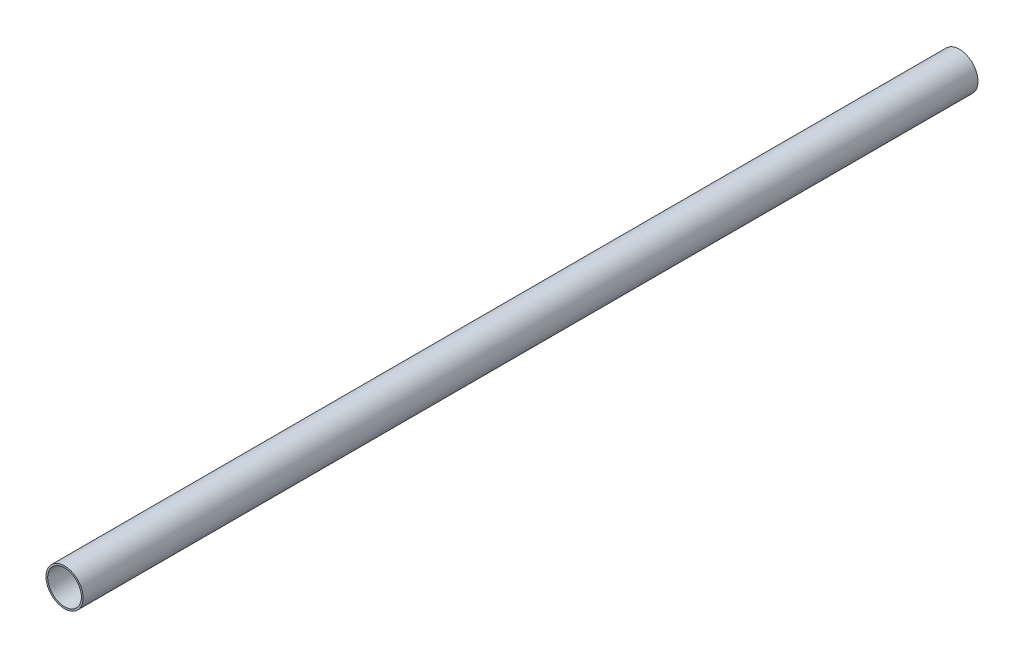
ISO-10303-21;
HEADER;
FILE_DESCRIPTION(('STEP AP214'),'2;1');
FILE_NAME('part.step','',(''),(''),'','','');
FILE_SCHEMA(('AUTOMOTIVE_DESIGN { 1 0 10303 214 1 1 1 1 }'));
ENDSEC;
DATA;
#1=APPLICATION_CONTEXT('core data for automotive mechanical design processes');
#2=APPLICATION_PROTOCOL_DEFINITION('international standard','automotive_design',2000,#1);
#3=PRODUCT_CONTEXT('',#1,'mechanical');
#4=PRODUCT('Part','Part','',(#3));
#5=PRODUCT_RELATED_PRODUCT_CATEGORY('part','',(#4));
#6=PRODUCT_DEFINITION_FORMATION('','',#4);
#7=PRODUCT_DEFINITION_CONTEXT('part definition',#1,'design');
#8=PRODUCT_DEFINITION('design','',#6,#7);
#9=PRODUCT_DEFINITION_SHAPE('','',#8);
#10=(LENGTH_UNIT() NAMED_UNIT(*) SI_UNIT(.MILLI.,.METRE.));
#11=(NAMED_UNIT(*) PLANE_ANGLE_UNIT() SI_UNIT($,.RADIAN.));
#12=(NAMED_UNIT(*) SI_UNIT($,.STERADIAN.) SOLID_ANGLE_UNIT());
#13=UNCERTAINTY_MEASURE_WITH_UNIT(LENGTH_MEASURE(1.E-05),#10,'distance_accuracy_value','');
#14=(GEOMETRIC_REPRESENTATION_CONTEXT(3) GLOBAL_UNCERTAINTY_ASSIGNED_CONTEXT((#13)) GLOBAL_UNIT_ASSIGNED_CONTEXT((#10,
#11,#12)) REPRESENTATION_CONTEXT('',''));
#15=CARTESIAN_POINT('',(0.,0.,0.));
#16=DIRECTION('',(0.,0.,1.));
#17=DIRECTION('',(1.,0.,0.));
#18=AXIS2_PLACEMENT_3D('',#15,#16,#17);
#19=CARTESIAN_POINT('',(0.,0.,965.2));
#20=DIRECTION('',(0.,0.,1.));
#21=DIRECTION('',(1.,0.,0.));
#22=AXIS2_PLACEMENT_3D('',#19,#20,#21);
#23=PLANE('',#22);
#24=CARTESIAN_POINT('',(0.,0.,965.2));
#25=DIRECTION('',(0.,0.,1.));
#26=DIRECTION('',(1.,0.,0.));
#27=AXIS2_PLACEMENT_3D('',#24,#25,#26);
#28=CIRCLE('',#27,19.2405);
#29=CARTESIAN_POINT('',(19.2405,0.,965.2));
#30=VERTEX_POINT('',#29);
#31=EDGE_CURVE('E10',#30,#30,#28,.T.);
#32=ORIENTED_EDGE('',*,*,#31,.T.);
#33=EDGE_LOOP('',(#32));
#34=FACE_BOUND('',#33,.T.);
#35=CARTESIAN_POINT('',(0.,0.,965.2));
#36=DIRECTION('',(0.,0.,1.));
#37=DIRECTION('',(1.,0.,0.));
#38=AXIS2_PLACEMENT_3D('',#35,#36,#37);
#39=CIRCLE('',#38,17.4625);
#40=CARTESIAN_POINT('',(17.4625,0.,965.2));
#41=VERTEX_POINT('',#40);
#42=EDGE_CURVE('E38',#41,#41,#39,.T.);
#43=ORIENTED_EDGE('',*,*,#42,.F.);
#44=EDGE_LOOP('',(#43));
#45=FACE_BOUND('',#44,.T.);
#46=ADVANCED_FACE('F30',(#34,#45),#23,.T.);
#47=CARTESIAN_POINT('',(0.,0.,965.2));
#48=DIRECTION('',(0.,0.,-1.));
#49=DIRECTION('',(-1.,0.,0.));
#50=AXIS2_PLACEMENT_3D('',#47,#48,#49);
#51=CYLINDRICAL_SURFACE('',#50,19.2405);
#52=ORIENTED_EDGE('',*,*,#31,.F.);
#53=EDGE_LOOP('',(#52));
#54=FACE_BOUND('',#53,.T.);
#55=CARTESIAN_POINT('',(0.,0.,38.1));
#56=DIRECTION('',(0.,0.,1.));
#57=DIRECTION('',(1.,0.,0.));
#58=AXIS2_PLACEMENT_3D('',#55,#56,#57);
#59=CIRCLE('',#58,19.2405);
#60=CARTESIAN_POINT('',(19.2405,0.,38.1));
#61=VERTEX_POINT('',#60);
#62=EDGE_CURVE('E42',#61,#61,#59,.T.);
#63=ORIENTED_EDGE('',*,*,#62,.T.);
#64=EDGE_LOOP('',(#63));
#65=FACE_BOUND('',#64,.T.);
#66=ADVANCED_FACE('F32',(#54,#65),#51,.T.);
#67=CARTESIAN_POINT('',(0.,0.,965.2));
#68=DIRECTION('',(0.,0.,-1.));
#69=DIRECTION('',(-1.,0.,0.));
#70=AXIS2_PLACEMENT_3D('',#67,#68,#69);
#71=CYLINDRICAL_SURFACE('',#70,17.4625);
#72=CARTESIAN_POINT('',(0.,0.,38.1));
#73=DIRECTION('',(0.,0.,1.));
#74=DIRECTION('',(1.,0.,0.));
#75=AXIS2_PLACEMENT_3D('',#72,#73,#74);
#76=CIRCLE('',#75,17.4625);
#77=CARTESIAN_POINT('',(17.4625,0.,38.1));
#78=VERTEX_POINT('',#77);
#79=EDGE_CURVE('E34',#78,#78,#76,.T.);
#80=ORIENTED_EDGE('',*,*,#79,.F.);
#81=EDGE_LOOP('',(#80));
#82=FACE_BOUND('',#81,.T.);
#83=ORIENTED_EDGE('',*,*,#42,.T.);
#84=EDGE_LOOP('',(#83));
#85=FACE_BOUND('',#84,.T.);
#86=ADVANCED_FACE('F54',(#82,#85),#71,.F.);
#87=CARTESIAN_POINT('',(-19.2405,-19.2405,38.1));
#88=DIRECTION('',(0.,0.,1.));
#89=DIRECTION('',(1.,0.,0.));
#90=AXIS2_PLACEMENT_3D('',#87,#88,#89);
#91=PLANE('',#90);
#92=ORIENTED_EDGE('',*,*,#79,.T.);
#93=EDGE_LOOP('',(#92));
#94=FACE_BOUND('',#93,.T.);
#95=ORIENTED_EDGE('',*,*,#62,.F.);
#96=EDGE_LOOP('',(#95));
#97=FACE_BOUND('',#96,.T.);
#98=ADVANCED_FACE('F51',(#94,#97),#91,.F.);
#99=CLOSED_SHELL('',(#46,#66,#86,#98));
#100=MANIFOLD_SOLID_BREP('B2',#99);
#101=ADVANCED_BREP_SHAPE_REPRESENTATION('',(#18,#100),#14);
#102=SHAPE_DEFINITION_REPRESENTATION(#9,#101);
ENDSEC;
END-ISO-10303-21;
